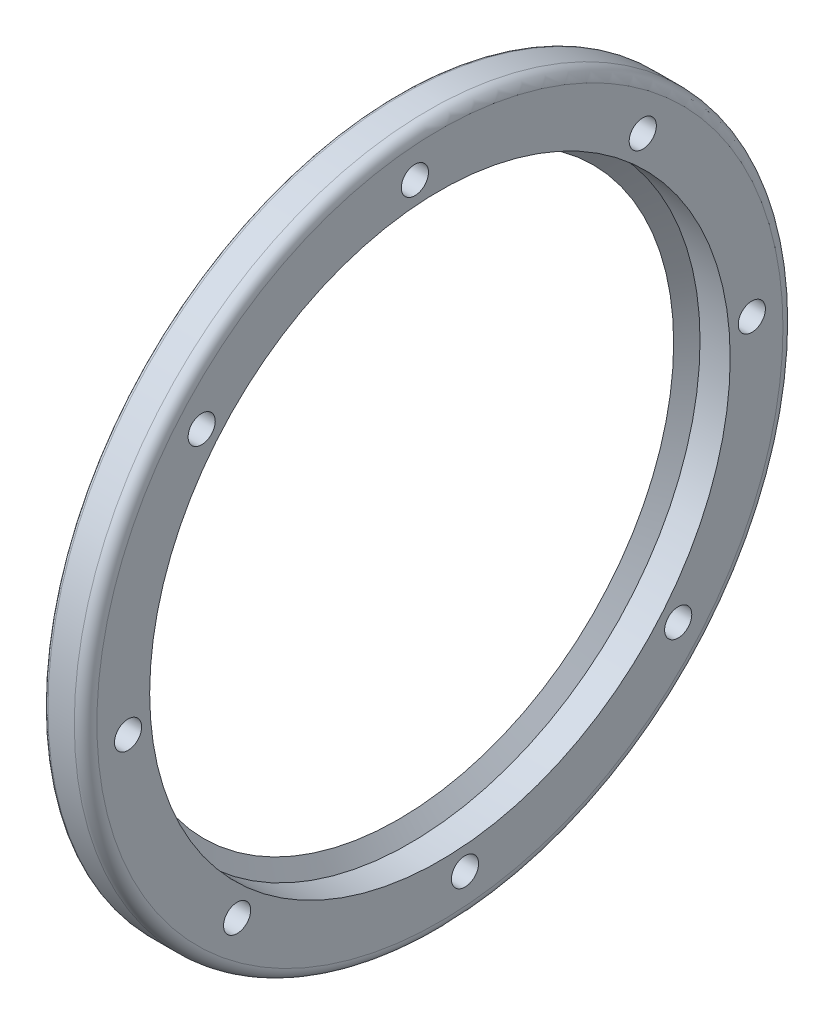
ISO-10303-21;
HEADER;
FILE_DESCRIPTION(('STEP AP214'),'2;1');
FILE_NAME('part.step','',(''),(''),'','','');
FILE_SCHEMA(('AUTOMOTIVE_DESIGN { 1 0 10303 214 1 1 1 1 }'));
ENDSEC;
DATA;
#1=APPLICATION_CONTEXT('core data for automotive mechanical design processes');
#2=APPLICATION_PROTOCOL_DEFINITION('international standard','automotive_design',2000,#1);
#3=PRODUCT_CONTEXT('',#1,'mechanical');
#4=PRODUCT('Part','Part','',(#3));
#5=PRODUCT_RELATED_PRODUCT_CATEGORY('part','',(#4));
#6=PRODUCT_DEFINITION_FORMATION('','',#4);
#7=PRODUCT_DEFINITION_CONTEXT('part definition',#1,'design');
#8=PRODUCT_DEFINITION('design','',#6,#7);
#9=PRODUCT_DEFINITION_SHAPE('','',#8);
#10=(LENGTH_UNIT() NAMED_UNIT(*) SI_UNIT(.MILLI.,.METRE.));
#11=(NAMED_UNIT(*) PLANE_ANGLE_UNIT() SI_UNIT($,.RADIAN.));
#12=(NAMED_UNIT(*) SI_UNIT($,.STERADIAN.) SOLID_ANGLE_UNIT());
#13=UNCERTAINTY_MEASURE_WITH_UNIT(LENGTH_MEASURE(1.E-05),#10,'distance_accuracy_value','');
#14=(GEOMETRIC_REPRESENTATION_CONTEXT(3) GLOBAL_UNCERTAINTY_ASSIGNED_CONTEXT((#13)) GLOBAL_UNIT_ASSIGNED_CONTEXT((#10,
#11,#12)) REPRESENTATION_CONTEXT('',''));
#15=CARTESIAN_POINT('',(0.,0.,0.));
#16=DIRECTION('',(0.,0.,1.));
#17=DIRECTION('',(1.,0.,0.));
#18=AXIS2_PLACEMENT_3D('',#15,#16,#17);
#19=CARTESIAN_POINT('',(0.,0.,0.));
#20=DIRECTION('',(1.,0.,0.));
#21=DIRECTION('',(0.,0.,-1.));
#22=AXIS2_PLACEMENT_3D('',#19,#20,#21);
#23=PLANE('',#22);
#24=CARTESIAN_POINT('',(0.,-44.5,0.));
#25=DIRECTION('',(1.,0.,0.));
#26=DIRECTION('',(0.,0.,-1.));
#27=AXIS2_PLACEMENT_3D('',#24,#25,#26);
#28=CIRCLE('',#27,46.5);
#29=CARTESIAN_POINT('',(0.,-44.5,-46.5));
#30=VERTEX_POINT('',#29);
#31=EDGE_CURVE('E49',#30,#30,#28,.F.);
#32=ORIENTED_EDGE('',*,*,#31,.T.);
#33=EDGE_LOOP('',(#32));
#34=FACE_BOUND('',#33,.T.);
#35=CARTESIAN_POINT('',(0.,-47.8230274325458,41.3667437524683));
#36=DIRECTION('',(1.,0.,0.));
#37=DIRECTION('',(0.,0.,-1.));
#38=AXIS2_PLACEMENT_3D('',#35,#36,#37);
#39=CIRCLE('',#38,1.79999999999999);
#40=CARTESIAN_POINT('',(0.,-47.8230274325458,39.5667437524683));
#41=VERTEX_POINT('',#40);
#42=EDGE_CURVE('E82',#41,#41,#39,.F.);
#43=ORIENTED_EDGE('',*,*,#42,.F.);
#44=EDGE_LOOP('',(#43));
#45=FACE_BOUND('',#44,.T.);
#46=CARTESIAN_POINT('',(0.,-76.1004402545986,26.9009697913545));
#47=DIRECTION('',(1.,0.,0.));
#48=DIRECTION('',(0.,0.,-1.));
#49=AXIS2_PLACEMENT_3D('',#46,#47,#48);
#50=CIRCLE('',#49,1.8);
#51=CARTESIAN_POINT('',(0.,-76.1004402545986,25.1009697913545));
#52=VERTEX_POINT('',#51);
#53=EDGE_CURVE('E77',#52,#52,#50,.F.);
#54=ORIENTED_EDGE('',*,*,#53,.F.);
#55=EDGE_LOOP('',(#54));
#56=FACE_BOUND('',#55,.T.);
#57=CARTESIAN_POINT('',(0.,-44.5,0.));
#58=DIRECTION('',(-1.,0.,0.));
#59=DIRECTION('',(0.,0.,1.));
#60=AXIS2_PLACEMENT_3D('',#57,#58,#59);
#61=CIRCLE('',#60,36.5);
#62=CARTESIAN_POINT('',(0.,-44.5,36.5));
#63=VERTEX_POINT('',#62);
#64=EDGE_CURVE('E65',#63,#63,#61,.T.);
#65=ORIENTED_EDGE('',*,*,#64,.F.);
#66=EDGE_LOOP('',(#65));
#67=FACE_BOUND('',#66,.T.);
#68=CARTESIAN_POINT('',(0.,-17.5990302086454,31.6004402545985));
#69=DIRECTION('',(1.,0.,0.));
#70=DIRECTION('',(0.,0.,-1.));
#71=AXIS2_PLACEMENT_3D('',#68,#69,#70);
#72=CIRCLE('',#71,1.79999999999999);
#73=CARTESIAN_POINT('',(0.,-17.5990302086454,29.8004402545985));
#74=VERTEX_POINT('',#73);
#75=EDGE_CURVE('E90',#74,#74,#72,.F.);
#76=ORIENTED_EDGE('',*,*,#75,.F.);
#77=EDGE_LOOP('',(#76));
#78=FACE_BOUND('',#77,.T.);
#79=CARTESIAN_POINT('',(0.,-3.13325624753173,3.32302743254563));
#80=DIRECTION('',(1.,0.,0.));
#81=DIRECTION('',(0.,0.,-1.));
#82=AXIS2_PLACEMENT_3D('',#79,#80,#81);
#83=CIRCLE('',#82,1.79999999999999);
#84=CARTESIAN_POINT('',(0.,-3.13325624753173,1.52302743254564));
#85=VERTEX_POINT('',#84);
#86=EDGE_CURVE('E98',#85,#85,#83,.F.);
#87=ORIENTED_EDGE('',*,*,#86,.F.);
#88=EDGE_LOOP('',(#87));
#89=FACE_BOUND('',#88,.T.);
#90=CARTESIAN_POINT('',(0.,-12.8995597454014,-26.9009697913545));
#91=DIRECTION('',(1.,0.,0.));
#92=DIRECTION('',(0.,0.,-1.));
#93=AXIS2_PLACEMENT_3D('',#90,#91,#92);
#94=CIRCLE('',#93,1.79999999999999);
#95=CARTESIAN_POINT('',(0.,-12.8995597454014,-28.7009697913545));
#96=VERTEX_POINT('',#95);
#97=EDGE_CURVE('E106',#96,#96,#94,.F.);
#98=ORIENTED_EDGE('',*,*,#97,.F.);
#99=EDGE_LOOP('',(#98));
#100=FACE_BOUND('',#99,.T.);
#101=CARTESIAN_POINT('',(0.,-41.1769725674545,-41.3667437524683));
#102=DIRECTION('',(1.,0.,0.));
#103=DIRECTION('',(0.,0.,-1.));
#104=AXIS2_PLACEMENT_3D('',#101,#102,#103);
#105=CIRCLE('',#104,1.79999999999999);
#106=CARTESIAN_POINT('',(0.,-41.1769725674545,-43.1667437524683));
#107=VERTEX_POINT('',#106);
#108=EDGE_CURVE('E114',#107,#107,#105,.F.);
#109=ORIENTED_EDGE('',*,*,#108,.F.);
#110=EDGE_LOOP('',(#109));
#111=FACE_BOUND('',#110,.T.);
#112=CARTESIAN_POINT('',(0.,-71.4009697913548,-31.6004402545984));
#113=DIRECTION('',(1.,0.,0.));
#114=DIRECTION('',(0.,0.,-1.));
#115=AXIS2_PLACEMENT_3D('',#112,#113,#114);
#116=CIRCLE('',#115,1.8);
#117=CARTESIAN_POINT('',(0.,-71.4009697913548,-33.4004402545984));
#118=VERTEX_POINT('',#117);
#119=EDGE_CURVE('E122',#118,#118,#116,.F.);
#120=ORIENTED_EDGE('',*,*,#119,.F.);
#121=EDGE_LOOP('',(#120));
#122=FACE_BOUND('',#121,.T.);
#123=CARTESIAN_POINT('',(0.,-85.8667437524683,-3.32302743254533));
#124=DIRECTION('',(1.,0.,0.));
#125=DIRECTION('',(0.,0.,-1.));
#126=AXIS2_PLACEMENT_3D('',#123,#124,#125);
#127=CIRCLE('',#126,1.8);
#128=CARTESIAN_POINT('',(0.,-85.8667437524683,-5.12302743254533));
#129=VERTEX_POINT('',#128);
#130=EDGE_CURVE('E130',#129,#129,#127,.F.);
#131=ORIENTED_EDGE('',*,*,#130,.F.);
#132=EDGE_LOOP('',(#131));
#133=FACE_BOUND('',#132,.T.);
#134=ADVANCED_FACE('F41',(#34,#45,#56,#67,#78,#89,#100,#111,#122,#133),#23,.F.);
#135=CARTESIAN_POINT('',(5.5,0.,0.));
#136=DIRECTION('',(1.,0.,0.));
#137=DIRECTION('',(0.,0.,-1.));
#138=AXIS2_PLACEMENT_3D('',#135,#136,#137);
#139=PLANE('',#138);
#140=CARTESIAN_POINT('',(5.5,-44.5,0.));
#141=DIRECTION('',(1.,0.,0.));
#142=DIRECTION('',(0.,0.,-1.));
#143=AXIS2_PLACEMENT_3D('',#140,#141,#142);
#144=CIRCLE('',#143,45.5);
#145=CARTESIAN_POINT('',(5.5,-44.5,-45.5));
#146=VERTEX_POINT('',#145);
#147=EDGE_CURVE('E54',#146,#146,#144,.T.);
#148=ORIENTED_EDGE('',*,*,#147,.T.);
#149=EDGE_LOOP('',(#148));
#150=FACE_BOUND('',#149,.T.);
#151=CARTESIAN_POINT('',(5.5,-85.8667437524683,-3.32302743254533));
#152=DIRECTION('',(1.,0.,0.));
#153=DIRECTION('',(0.,0.,-1.));
#154=AXIS2_PLACEMENT_3D('',#151,#152,#153);
#155=CIRCLE('',#154,1.8);
#156=CARTESIAN_POINT('',(5.5,-85.8667437524683,-5.12302743254533));
#157=VERTEX_POINT('',#156);
#158=EDGE_CURVE('E134',#157,#157,#155,.T.);
#159=ORIENTED_EDGE('',*,*,#158,.F.);
#160=EDGE_LOOP('',(#159));
#161=FACE_BOUND('',#160,.T.);
#162=CARTESIAN_POINT('',(5.5,-71.4009697913548,-31.6004402545984));
#163=DIRECTION('',(1.,0.,0.));
#164=DIRECTION('',(0.,0.,-1.));
#165=AXIS2_PLACEMENT_3D('',#162,#163,#164);
#166=CIRCLE('',#165,1.8);
#167=CARTESIAN_POINT('',(5.5,-71.4009697913548,-33.4004402545984));
#168=VERTEX_POINT('',#167);
#169=EDGE_CURVE('E126',#168,#168,#166,.T.);
#170=ORIENTED_EDGE('',*,*,#169,.F.);
#171=EDGE_LOOP('',(#170));
#172=FACE_BOUND('',#171,.T.);
#173=CARTESIAN_POINT('',(5.5,-41.1769725674545,-41.3667437524683));
#174=DIRECTION('',(1.,0.,0.));
#175=DIRECTION('',(0.,0.,-1.));
#176=AXIS2_PLACEMENT_3D('',#173,#174,#175);
#177=CIRCLE('',#176,1.79999999999999);
#178=CARTESIAN_POINT('',(5.5,-41.1769725674545,-43.1667437524683));
#179=VERTEX_POINT('',#178);
#180=EDGE_CURVE('E118',#179,#179,#177,.T.);
#181=ORIENTED_EDGE('',*,*,#180,.F.);
#182=EDGE_LOOP('',(#181));
#183=FACE_BOUND('',#182,.T.);
#184=CARTESIAN_POINT('',(5.5,-12.8995597454014,-26.9009697913545));
#185=DIRECTION('',(1.,0.,0.));
#186=DIRECTION('',(0.,0.,-1.));
#187=AXIS2_PLACEMENT_3D('',#184,#185,#186);
#188=CIRCLE('',#187,1.79999999999999);
#189=CARTESIAN_POINT('',(5.5,-12.8995597454014,-28.7009697913545));
#190=VERTEX_POINT('',#189);
#191=EDGE_CURVE('E110',#190,#190,#188,.T.);
#192=ORIENTED_EDGE('',*,*,#191,.F.);
#193=EDGE_LOOP('',(#192));
#194=FACE_BOUND('',#193,.T.);
#195=CARTESIAN_POINT('',(5.5,-3.13325624753173,3.32302743254563));
#196=DIRECTION('',(1.,0.,0.));
#197=DIRECTION('',(0.,0.,-1.));
#198=AXIS2_PLACEMENT_3D('',#195,#196,#197);
#199=CIRCLE('',#198,1.79999999999999);
#200=CARTESIAN_POINT('',(5.5,-3.13325624753173,1.52302743254564));
#201=VERTEX_POINT('',#200);
#202=EDGE_CURVE('E102',#201,#201,#199,.T.);
#203=ORIENTED_EDGE('',*,*,#202,.F.);
#204=EDGE_LOOP('',(#203));
#205=FACE_BOUND('',#204,.T.);
#206=CARTESIAN_POINT('',(5.5,-17.5990302086454,31.6004402545985));
#207=DIRECTION('',(1.,0.,0.));
#208=DIRECTION('',(0.,0.,-1.));
#209=AXIS2_PLACEMENT_3D('',#206,#207,#208);
#210=CIRCLE('',#209,1.79999999999999);
#211=CARTESIAN_POINT('',(5.5,-17.5990302086454,29.8004402545986));
#212=VERTEX_POINT('',#211);
#213=EDGE_CURVE('E94',#212,#212,#210,.T.);
#214=ORIENTED_EDGE('',*,*,#213,.F.);
#215=EDGE_LOOP('',(#214));
#216=FACE_BOUND('',#215,.T.);
#217=CARTESIAN_POINT('',(5.5,-47.8230274325458,41.3667437524683));
#218=DIRECTION('',(1.,0.,0.));
#219=DIRECTION('',(0.,0.,-1.));
#220=AXIS2_PLACEMENT_3D('',#217,#218,#219);
#221=CIRCLE('',#220,1.79999999999999);
#222=CARTESIAN_POINT('',(5.5,-47.8230274325458,39.5667437524683));
#223=VERTEX_POINT('',#222);
#224=EDGE_CURVE('E86',#223,#223,#221,.T.);
#225=ORIENTED_EDGE('',*,*,#224,.F.);
#226=EDGE_LOOP('',(#225));
#227=FACE_BOUND('',#226,.T.);
#228=CARTESIAN_POINT('',(5.5,-76.1004402545986,26.9009697913545));
#229=DIRECTION('',(1.,0.,0.));
#230=DIRECTION('',(0.,0.,-1.));
#231=AXIS2_PLACEMENT_3D('',#228,#229,#230);
#232=CIRCLE('',#231,1.8);
#233=CARTESIAN_POINT('',(5.5,-76.1004402545986,25.1009697913545));
#234=VERTEX_POINT('',#233);
#235=EDGE_CURVE('E78',#234,#234,#232,.T.);
#236=ORIENTED_EDGE('',*,*,#235,.F.);
#237=EDGE_LOOP('',(#236));
#238=FACE_BOUND('',#237,.T.);
#239=CARTESIAN_POINT('',(5.50000000000006,-44.5,0.));
#240=DIRECTION('',(-1.,0.,0.));
#241=DIRECTION('',(0.,0.,1.));
#242=AXIS2_PLACEMENT_3D('',#239,#240,#241);
#243=CIRCLE('',#242,38.5);
#244=CARTESIAN_POINT('',(5.50000000000006,-44.5,38.5));
#245=VERTEX_POINT('',#244);
#246=EDGE_CURVE('E73',#245,#245,#243,.T.);
#247=ORIENTED_EDGE('',*,*,#246,.T.);
#248=EDGE_LOOP('',(#247));
#249=FACE_BOUND('',#248,.T.);
#250=ADVANCED_FACE('F146',(#150,#161,#172,#183,#194,#205,#216,#227,#238,#249),#139,.T.);
#251=CARTESIAN_POINT('',(-1000.,-44.5,0.));
#252=DIRECTION('',(-1.,0.,0.));
#253=DIRECTION('',(0.,0.,1.));
#254=AXIS2_PLACEMENT_3D('',#251,#252,#253);
#255=CYLINDRICAL_SURFACE('',#254,47.);
#256=CARTESIAN_POINT('',(0.499999999999945,-44.5,0.));
#257=DIRECTION('',(1.,0.,0.));
#258=DIRECTION('',(0.,0.,-1.));
#259=AXIS2_PLACEMENT_3D('',#256,#257,#258);
#260=CIRCLE('',#259,47.);
#261=CARTESIAN_POINT('',(0.499999999999945,-44.5,-47.));
#262=VERTEX_POINT('',#261);
#263=EDGE_CURVE('E10',#262,#262,#260,.T.);
#264=ORIENTED_EDGE('',*,*,#263,.T.);
#265=EDGE_LOOP('',(#264));
#266=FACE_BOUND('',#265,.T.);
#267=CARTESIAN_POINT('',(4.,-44.5,0.));
#268=DIRECTION('',(1.,0.,0.));
#269=DIRECTION('',(0.,0.,-1.));
#270=AXIS2_PLACEMENT_3D('',#267,#268,#269);
#271=CIRCLE('',#270,47.);
#272=CARTESIAN_POINT('',(4.,-44.5,-47.));
#273=VERTEX_POINT('',#272);
#274=EDGE_CURVE('E59',#273,#273,#271,.F.);
#275=ORIENTED_EDGE('',*,*,#274,.T.);
#276=EDGE_LOOP('',(#275));
#277=FACE_BOUND('',#276,.T.);
#278=ADVANCED_FACE('F151',(#266,#277),#255,.T.);
#279=CARTESIAN_POINT('',(0.,-44.5,0.));
#280=DIRECTION('',(1.,0.,0.));
#281=DIRECTION('',(0.,0.,-1.));
#282=AXIS2_PLACEMENT_3D('',#279,#280,#281);
#283=CONICAL_SURFACE('',#282,36.5,0.927295218001594);
#284=CARTESIAN_POINT('',(1.50000000000006,-44.5,0.));
#285=DIRECTION('',(-1.,0.,0.));
#286=DIRECTION('',(0.,0.,1.));
#287=AXIS2_PLACEMENT_3D('',#284,#285,#286);
#288=CIRCLE('',#287,38.5);
#289=CARTESIAN_POINT('',(1.50000000000006,-44.5,38.5));
#290=VERTEX_POINT('',#289);
#291=EDGE_CURVE('E69',#290,#290,#288,.T.);
#292=ORIENTED_EDGE('',*,*,#291,.F.);
#293=EDGE_LOOP('',(#292));
#294=FACE_BOUND('',#293,.T.);
#295=ORIENTED_EDGE('',*,*,#64,.T.);
#296=EDGE_LOOP('',(#295));
#297=FACE_BOUND('',#296,.T.);
#298=ADVANCED_FACE('F157',(#294,#297),#283,.F.);
#299=CARTESIAN_POINT('',(-1000.,-44.5,0.));
#300=DIRECTION('',(-1.,0.,0.));
#301=DIRECTION('',(0.,0.,1.));
#302=AXIS2_PLACEMENT_3D('',#299,#300,#301);
#303=CYLINDRICAL_SURFACE('',#302,38.5);
#304=ORIENTED_EDGE('',*,*,#291,.T.);
#305=EDGE_LOOP('',(#304));
#306=FACE_BOUND('',#305,.T.);
#307=ORIENTED_EDGE('',*,*,#246,.F.);
#308=EDGE_LOOP('',(#307));
#309=FACE_BOUND('',#308,.T.);
#310=ADVANCED_FACE('F193',(#306,#309),#303,.F.);
#311=CARTESIAN_POINT('',(5.5,-76.1004402545986,26.9009697913545));
#312=DIRECTION('',(1.,0.,0.));
#313=DIRECTION('',(0.,0.,-1.));
#314=AXIS2_PLACEMENT_3D('',#311,#312,#313);
#315=CYLINDRICAL_SURFACE('',#314,1.8);
#316=ORIENTED_EDGE('',*,*,#53,.T.);
#317=EDGE_LOOP('',(#316));
#318=FACE_BOUND('',#317,.T.);
#319=ORIENTED_EDGE('',*,*,#235,.T.);
#320=EDGE_LOOP('',(#319));
#321=FACE_BOUND('',#320,.T.);
#322=ADVANCED_FACE('F195',(#318,#321),#315,.F.);
#323=CARTESIAN_POINT('',(5.5,-47.8230274325458,41.3667437524683));
#324=DIRECTION('',(1.,0.,0.));
#325=DIRECTION('',(0.,0.,-1.));
#326=AXIS2_PLACEMENT_3D('',#323,#324,#325);
#327=CYLINDRICAL_SURFACE('',#326,1.79999999999999);
#328=ORIENTED_EDGE('',*,*,#42,.T.);
#329=EDGE_LOOP('',(#328));
#330=FACE_BOUND('',#329,.T.);
#331=ORIENTED_EDGE('',*,*,#224,.T.);
#332=EDGE_LOOP('',(#331));
#333=FACE_BOUND('',#332,.T.);
#334=ADVANCED_FACE('F201',(#330,#333),#327,.F.);
#335=CARTESIAN_POINT('',(5.5,-17.5990302086454,31.6004402545985));
#336=DIRECTION('',(1.,0.,0.));
#337=DIRECTION('',(0.,0.,-1.));
#338=AXIS2_PLACEMENT_3D('',#335,#336,#337);
#339=CYLINDRICAL_SURFACE('',#338,1.79999999999999);
#340=ORIENTED_EDGE('',*,*,#75,.T.);
#341=EDGE_LOOP('',(#340));
#342=FACE_BOUND('',#341,.T.);
#343=ORIENTED_EDGE('',*,*,#213,.T.);
#344=EDGE_LOOP('',(#343));
#345=FACE_BOUND('',#344,.T.);
#346=ADVANCED_FACE('F208',(#342,#345),#339,.F.);
#347=CARTESIAN_POINT('',(5.5,-3.13325624753173,3.32302743254563));
#348=DIRECTION('',(1.,0.,0.));
#349=DIRECTION('',(0.,0.,-1.));
#350=AXIS2_PLACEMENT_3D('',#347,#348,#349);
#351=CYLINDRICAL_SURFACE('',#350,1.79999999999999);
#352=ORIENTED_EDGE('',*,*,#86,.T.);
#353=EDGE_LOOP('',(#352));
#354=FACE_BOUND('',#353,.T.);
#355=ORIENTED_EDGE('',*,*,#202,.T.);
#356=EDGE_LOOP('',(#355));
#357=FACE_BOUND('',#356,.T.);
#358=ADVANCED_FACE('F212',(#354,#357),#351,.F.);
#359=CARTESIAN_POINT('',(5.5,-12.8995597454014,-26.9009697913545));
#360=DIRECTION('',(1.,0.,0.));
#361=DIRECTION('',(0.,0.,-1.));
#362=AXIS2_PLACEMENT_3D('',#359,#360,#361);
#363=CYLINDRICAL_SURFACE('',#362,1.79999999999999);
#364=ORIENTED_EDGE('',*,*,#97,.T.);
#365=EDGE_LOOP('',(#364));
#366=FACE_BOUND('',#365,.T.);
#367=ORIENTED_EDGE('',*,*,#191,.T.);
#368=EDGE_LOOP('',(#367));
#369=FACE_BOUND('',#368,.T.);
#370=ADVANCED_FACE('F216',(#366,#369),#363,.F.);
#371=CARTESIAN_POINT('',(5.5,-41.1769725674545,-41.3667437524683));
#372=DIRECTION('',(1.,0.,0.));
#373=DIRECTION('',(0.,0.,-1.));
#374=AXIS2_PLACEMENT_3D('',#371,#372,#373);
#375=CYLINDRICAL_SURFACE('',#374,1.79999999999999);
#376=ORIENTED_EDGE('',*,*,#108,.T.);
#377=EDGE_LOOP('',(#376));
#378=FACE_BOUND('',#377,.T.);
#379=ORIENTED_EDGE('',*,*,#180,.T.);
#380=EDGE_LOOP('',(#379));
#381=FACE_BOUND('',#380,.T.);
#382=ADVANCED_FACE('F220',(#378,#381),#375,.F.);
#383=CARTESIAN_POINT('',(5.5,-71.4009697913548,-31.6004402545984));
#384=DIRECTION('',(1.,0.,0.));
#385=DIRECTION('',(0.,0.,-1.));
#386=AXIS2_PLACEMENT_3D('',#383,#384,#385);
#387=CYLINDRICAL_SURFACE('',#386,1.8);
#388=ORIENTED_EDGE('',*,*,#119,.T.);
#389=EDGE_LOOP('',(#388));
#390=FACE_BOUND('',#389,.T.);
#391=ORIENTED_EDGE('',*,*,#169,.T.);
#392=EDGE_LOOP('',(#391));
#393=FACE_BOUND('',#392,.T.);
#394=ADVANCED_FACE('F168',(#390,#393),#387,.F.);
#395=CARTESIAN_POINT('',(5.5,-85.8667437524683,-3.32302743254533));
#396=DIRECTION('',(1.,0.,0.));
#397=DIRECTION('',(0.,0.,-1.));
#398=AXIS2_PLACEMENT_3D('',#395,#396,#397);
#399=CYLINDRICAL_SURFACE('',#398,1.8);
#400=ORIENTED_EDGE('',*,*,#130,.T.);
#401=EDGE_LOOP('',(#400));
#402=FACE_BOUND('',#401,.T.);
#403=ORIENTED_EDGE('',*,*,#158,.T.);
#404=EDGE_LOOP('',(#403));
#405=FACE_BOUND('',#404,.T.);
#406=ADVANCED_FACE('F142',(#402,#405),#399,.F.);
#407=CARTESIAN_POINT('',(4.,-44.5,0.));
#408=DIRECTION('',(1.,0.,0.));
#409=DIRECTION('',(0.,0.,-1.));
#410=AXIS2_PLACEMENT_3D('',#407,#408,#409);
#411=TOROIDAL_SURFACE('',#410,45.5,1.5);
#412=ORIENTED_EDGE('',*,*,#147,.F.);
#413=EDGE_LOOP('',(#412));
#414=FACE_BOUND('',#413,.T.);
#415=ORIENTED_EDGE('',*,*,#274,.F.);
#416=EDGE_LOOP('',(#415));
#417=FACE_BOUND('',#416,.T.);
#418=ADVANCED_FACE('F160',(#414,#417),#411,.T.);
#419=CARTESIAN_POINT('',(0.499999999999945,-44.5,0.));
#420=DIRECTION('',(1.,0.,0.));
#421=DIRECTION('',(0.,0.,-1.));
#422=AXIS2_PLACEMENT_3D('',#419,#420,#421);
#423=TOROIDAL_SURFACE('',#422,46.5,0.5);
#424=ORIENTED_EDGE('',*,*,#263,.F.);
#425=EDGE_LOOP('',(#424));
#426=FACE_BOUND('',#425,.T.);
#427=ORIENTED_EDGE('',*,*,#31,.F.);
#428=EDGE_LOOP('',(#427));
#429=FACE_BOUND('',#428,.T.);
#430=ADVANCED_FACE('F43',(#426,#429),#423,.T.);
#431=CLOSED_SHELL('',(#134,#250,#278,#298,#310,#322,#334,#346,#358,#370,#382,#394,#406,#418,#430));
#432=MANIFOLD_SOLID_BREP('B2',#431);
#433=ADVANCED_BREP_SHAPE_REPRESENTATION('',(#18,#432),#14);
#434=SHAPE_DEFINITION_REPRESENTATION(#9,#433);
ENDSEC;
END-ISO-10303-21;
